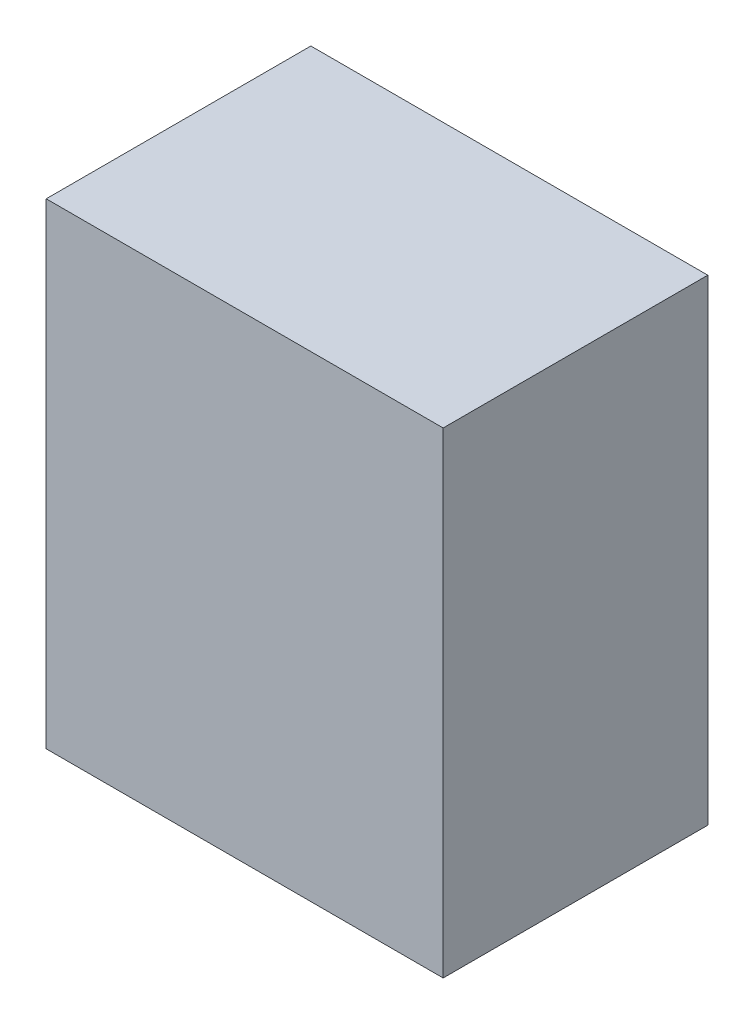
ISO-10303-21;
HEADER;
FILE_DESCRIPTION(('STEP AP214'),'2;1');
FILE_NAME('part.step','',(''),(''),'','','');
FILE_SCHEMA(('AUTOMOTIVE_DESIGN { 1 0 10303 214 1 1 1 1 }'));
ENDSEC;
DATA;
#1=APPLICATION_CONTEXT('core data for automotive mechanical design processes');
#2=APPLICATION_PROTOCOL_DEFINITION('international standard','automotive_design',2000,#1);
#3=PRODUCT_CONTEXT('',#1,'mechanical');
#4=PRODUCT('Part','Part','',(#3));
#5=PRODUCT_RELATED_PRODUCT_CATEGORY('part','',(#4));
#6=PRODUCT_DEFINITION_FORMATION('','',#4);
#7=PRODUCT_DEFINITION_CONTEXT('part definition',#1,'design');
#8=PRODUCT_DEFINITION('design','',#6,#7);
#9=PRODUCT_DEFINITION_SHAPE('','',#8);
#10=(LENGTH_UNIT() NAMED_UNIT(*) SI_UNIT(.MILLI.,.METRE.));
#11=(NAMED_UNIT(*) PLANE_ANGLE_UNIT() SI_UNIT($,.RADIAN.));
#12=(NAMED_UNIT(*) SI_UNIT($,.STERADIAN.) SOLID_ANGLE_UNIT());
#13=UNCERTAINTY_MEASURE_WITH_UNIT(LENGTH_MEASURE(1.E-05),#10,'distance_accuracy_value','');
#14=(GEOMETRIC_REPRESENTATION_CONTEXT(3) GLOBAL_UNCERTAINTY_ASSIGNED_CONTEXT((#13)) GLOBAL_UNIT_ASSIGNED_CONTEXT((#10,
#11,#12)) REPRESENTATION_CONTEXT('',''));
#15=CARTESIAN_POINT('',(0.,0.,0.));
#16=DIRECTION('',(0.,0.,1.));
#17=DIRECTION('',(1.,0.,0.));
#18=AXIS2_PLACEMENT_3D('',#15,#16,#17);
#19=CARTESIAN_POINT('',(-0.7499985,0.90000074,1.00000054));
#20=DIRECTION('',(0.,0.,-1.));
#21=DIRECTION('',(0.,-1.,0.));
#22=AXIS2_PLACEMENT_3D('',#19,#20,#21);
#23=PLANE('',#22);
#24=DIRECTION('',(0.,-1.,0.));
#25=VECTOR('',#24,1.);
#26=CARTESIAN_POINT('',(-0.7499985,0.90000074,1.00000054));
#27=LINE('',#26,#25);
#28=CARTESIAN_POINT('',(-0.7499985,0.90000074,1.00000054));
#29=VERTEX_POINT('',#28);
#30=CARTESIAN_POINT('',(-0.7499985,-0.8999982,1.00000054));
#31=VERTEX_POINT('',#30);
#32=EDGE_CURVE('E79',#29,#31,#27,.T.);
#33=ORIENTED_EDGE('',*,*,#32,.T.);
#34=DIRECTION('',(1.,0.,0.));
#35=VECTOR('',#34,1.);
#36=CARTESIAN_POINT('',(-0.7499985,-0.8999982,1.00000054));
#37=LINE('',#36,#35);
#38=CARTESIAN_POINT('',(0.75000104,-0.8999982,1.00000054));
#39=VERTEX_POINT('',#38);
#40=EDGE_CURVE('E77',#31,#39,#37,.T.);
#41=ORIENTED_EDGE('',*,*,#40,.T.);
#42=DIRECTION('',(0.,1.,0.));
#43=VECTOR('',#42,1.);
#44=CARTESIAN_POINT('',(0.75000104,-0.8999982,1.00000054));
#45=LINE('',#44,#43);
#46=CARTESIAN_POINT('',(0.75000104,0.90000074,1.00000054));
#47=VERTEX_POINT('',#46);
#48=EDGE_CURVE('E65',#39,#47,#45,.T.);
#49=ORIENTED_EDGE('',*,*,#48,.T.);
#50=DIRECTION('',(-1.,0.,0.));
#51=VECTOR('',#50,1.);
#52=CARTESIAN_POINT('',(0.75000104,0.90000074,1.00000054));
#53=LINE('',#52,#51);
#54=EDGE_CURVE('E11',#47,#29,#53,.T.);
#55=ORIENTED_EDGE('',*,*,#54,.T.);
#56=EDGE_LOOP('',(#33,#41,#49,#55));
#57=FACE_BOUND('',#56,.T.);
#58=ADVANCED_FACE('F17',(#57),#23,.F.);
#59=CARTESIAN_POINT('',(-0.7499985,0.90000074,0.));
#60=DIRECTION('',(0.,0.,-1.));
#61=DIRECTION('',(0.,-1.,0.));
#62=AXIS2_PLACEMENT_3D('',#59,#60,#61);
#63=PLANE('',#62);
#64=DIRECTION('',(-1.,0.,0.));
#65=VECTOR('',#64,1.);
#66=CARTESIAN_POINT('',(0.75000104,0.90000074,0.));
#67=LINE('',#66,#65);
#68=CARTESIAN_POINT('',(0.75000104,0.90000074,0.));
#69=VERTEX_POINT('',#68);
#70=CARTESIAN_POINT('',(-0.7499985,0.90000074,0.));
#71=VERTEX_POINT('',#70);
#72=EDGE_CURVE('E26',#69,#71,#67,.T.);
#73=ORIENTED_EDGE('',*,*,#72,.F.);
#74=DIRECTION('',(0.,1.,0.));
#75=VECTOR('',#74,1.);
#76=CARTESIAN_POINT('',(0.75000104,-0.8999982,0.));
#77=LINE('',#76,#75);
#78=CARTESIAN_POINT('',(0.75000104,-0.8999982,0.));
#79=VERTEX_POINT('',#78);
#80=EDGE_CURVE('E84',#79,#69,#77,.T.);
#81=ORIENTED_EDGE('',*,*,#80,.F.);
#82=DIRECTION('',(1.,0.,0.));
#83=VECTOR('',#82,1.);
#84=CARTESIAN_POINT('',(-0.7499985,-0.8999982,0.));
#85=LINE('',#84,#83);
#86=CARTESIAN_POINT('',(-0.7499985,-0.8999982,0.));
#87=VERTEX_POINT('',#86);
#88=EDGE_CURVE('E87',#87,#79,#85,.T.);
#89=ORIENTED_EDGE('',*,*,#88,.F.);
#90=DIRECTION('',(0.,-1.,0.));
#91=VECTOR('',#90,1.);
#92=CARTESIAN_POINT('',(-0.7499985,0.90000074,0.));
#93=LINE('',#92,#91);
#94=EDGE_CURVE('E108',#71,#87,#93,.T.);
#95=ORIENTED_EDGE('',*,*,#94,.F.);
#96=EDGE_LOOP('',(#73,#81,#89,#95));
#97=FACE_BOUND('',#96,.T.);
#98=ADVANCED_FACE('F111',(#97),#63,.T.);
#99=CARTESIAN_POINT('',(0.75000104,0.90000074,0.));
#100=DIRECTION('',(0.,-1.,0.));
#101=DIRECTION('',(0.,0.,-1.));
#102=AXIS2_PLACEMENT_3D('',#99,#100,#101);
#103=PLANE('',#102);
#104=ORIENTED_EDGE('',*,*,#72,.T.);
#105=DIRECTION('',(0.,0.,1.));
#106=VECTOR('',#105,1.);
#107=CARTESIAN_POINT('',(-0.7499985,0.90000074,0.));
#108=LINE('',#107,#106);
#109=EDGE_CURVE('E94',#71,#29,#108,.T.);
#110=ORIENTED_EDGE('',*,*,#109,.T.);
#111=ORIENTED_EDGE('',*,*,#54,.F.);
#112=DIRECTION('',(0.,0.,1.));
#113=VECTOR('',#112,1.);
#114=CARTESIAN_POINT('',(0.75000104,0.90000074,0.));
#115=LINE('',#114,#113);
#116=EDGE_CURVE('E72',#69,#47,#115,.T.);
#117=ORIENTED_EDGE('',*,*,#116,.F.);
#118=EDGE_LOOP('',(#104,#110,#111,#117));
#119=FACE_BOUND('',#118,.T.);
#120=ADVANCED_FACE('F102',(#119),#103,.F.);
#121=CARTESIAN_POINT('',(0.75000104,-0.8999982,0.));
#122=DIRECTION('',(-1.,0.,0.));
#123=DIRECTION('',(0.,0.,1.));
#124=AXIS2_PLACEMENT_3D('',#121,#122,#123);
#125=PLANE('',#124);
#126=ORIENTED_EDGE('',*,*,#80,.T.);
#127=ORIENTED_EDGE('',*,*,#116,.T.);
#128=ORIENTED_EDGE('',*,*,#48,.F.);
#129=DIRECTION('',(0.,0.,1.));
#130=VECTOR('',#129,1.);
#131=CARTESIAN_POINT('',(0.75000104,-0.8999982,0.));
#132=LINE('',#131,#130);
#133=EDGE_CURVE('E70',#79,#39,#132,.T.);
#134=ORIENTED_EDGE('',*,*,#133,.F.);
#135=EDGE_LOOP('',(#126,#127,#128,#134));
#136=FACE_BOUND('',#135,.T.);
#137=ADVANCED_FACE('F68',(#136),#125,.F.);
#138=CARTESIAN_POINT('',(-0.7499985,-0.8999982,0.));
#139=DIRECTION('',(0.,1.,0.));
#140=DIRECTION('',(1.,0.,0.));
#141=AXIS2_PLACEMENT_3D('',#138,#139,#140);
#142=PLANE('',#141);
#143=ORIENTED_EDGE('',*,*,#88,.T.);
#144=ORIENTED_EDGE('',*,*,#133,.T.);
#145=ORIENTED_EDGE('',*,*,#40,.F.);
#146=DIRECTION('',(0.,0.,1.));
#147=VECTOR('',#146,1.);
#148=CARTESIAN_POINT('',(-0.7499985,-0.8999982,0.));
#149=LINE('',#148,#147);
#150=EDGE_CURVE('E113',#87,#31,#149,.T.);
#151=ORIENTED_EDGE('',*,*,#150,.F.);
#152=EDGE_LOOP('',(#143,#144,#145,#151));
#153=FACE_BOUND('',#152,.T.);
#154=ADVANCED_FACE('F86',(#153),#142,.F.);
#155=CARTESIAN_POINT('',(-0.7499985,0.90000074,0.));
#156=DIRECTION('',(1.,0.,0.));
#157=DIRECTION('',(0.,1.,0.));
#158=AXIS2_PLACEMENT_3D('',#155,#156,#157);
#159=PLANE('',#158);
#160=ORIENTED_EDGE('',*,*,#94,.T.);
#161=ORIENTED_EDGE('',*,*,#150,.T.);
#162=ORIENTED_EDGE('',*,*,#32,.F.);
#163=ORIENTED_EDGE('',*,*,#109,.F.);
#164=EDGE_LOOP('',(#160,#161,#162,#163));
#165=FACE_BOUND('',#164,.T.);
#166=ADVANCED_FACE('F107',(#165),#159,.F.);
#167=CLOSED_SHELL('',(#58,#98,#120,#137,#154,#166));
#168=MANIFOLD_SOLID_BREP('B1',#167);
#169=ADVANCED_BREP_SHAPE_REPRESENTATION('',(#18,#168),#14);
#170=SHAPE_DEFINITION_REPRESENTATION(#9,#169);
ENDSEC;
END-ISO-10303-21;
